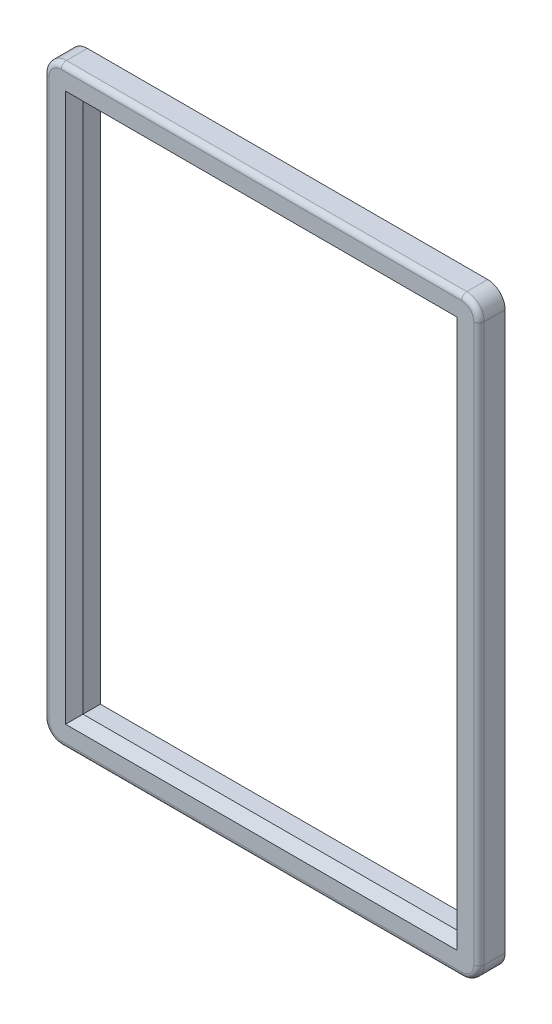
ISO-10303-21;
HEADER;
FILE_DESCRIPTION(('STEP AP214'),'2;1');
FILE_NAME('part.step','',(''),(''),'','','');
FILE_SCHEMA(('AUTOMOTIVE_DESIGN { 1 0 10303 214 1 1 1 1 }'));
ENDSEC;
DATA;
#1=APPLICATION_CONTEXT('core data for automotive mechanical design processes');
#2=APPLICATION_PROTOCOL_DEFINITION('international standard','automotive_design',2000,#1);
#3=PRODUCT_CONTEXT('',#1,'mechanical');
#4=PRODUCT('Part','Part','',(#3));
#5=PRODUCT_RELATED_PRODUCT_CATEGORY('part','',(#4));
#6=PRODUCT_DEFINITION_FORMATION('','',#4);
#7=PRODUCT_DEFINITION_CONTEXT('part definition',#1,'design');
#8=PRODUCT_DEFINITION('design','',#6,#7);
#9=PRODUCT_DEFINITION_SHAPE('','',#8);
#10=(LENGTH_UNIT() NAMED_UNIT(*) SI_UNIT(.MILLI.,.METRE.));
#11=(NAMED_UNIT(*) PLANE_ANGLE_UNIT() SI_UNIT($,.RADIAN.));
#12=(NAMED_UNIT(*) SI_UNIT($,.STERADIAN.) SOLID_ANGLE_UNIT());
#13=UNCERTAINTY_MEASURE_WITH_UNIT(LENGTH_MEASURE(1.E-05),#10,'distance_accuracy_value','');
#14=(GEOMETRIC_REPRESENTATION_CONTEXT(3) GLOBAL_UNCERTAINTY_ASSIGNED_CONTEXT((#13)) GLOBAL_UNIT_ASSIGNED_CONTEXT((#10,
#11,#12)) REPRESENTATION_CONTEXT('',''));
#15=CARTESIAN_POINT('',(0.,0.,0.));
#16=DIRECTION('',(0.,0.,1.));
#17=DIRECTION('',(1.,0.,0.));
#18=AXIS2_PLACEMENT_3D('',#15,#16,#17);
#19=CARTESIAN_POINT('',(0.,-34.,3.));
#20=DIRECTION('',(0.,1.,0.));
#21=DIRECTION('',(0.,0.,1.));
#22=AXIS2_PLACEMENT_3D('',#19,#20,#21);
#23=PLANE('',#22);
#24=DIRECTION('',(0.,0.,-1.));
#25=VECTOR('',#24,1.);
#26=CARTESIAN_POINT('',(23.,-34.,3.));
#27=LINE('',#26,#25);
#28=CARTESIAN_POINT('',(23.,-34.,0.));
#29=VERTEX_POINT('',#28);
#30=CARTESIAN_POINT('',(23.,-34.,2.4));
#31=VERTEX_POINT('',#30);
#32=EDGE_CURVE('E181',#29,#31,#27,.F.);
#33=ORIENTED_EDGE('',*,*,#32,.T.);
#34=DIRECTION('',(1.,0.,0.));
#35=VECTOR('',#34,1.);
#36=CARTESIAN_POINT('',(-23.,-34.,2.4));
#37=LINE('',#36,#35);
#38=CARTESIAN_POINT('',(-23.,-34.,2.4));
#39=VERTEX_POINT('',#38);
#40=EDGE_CURVE('E267',#31,#39,#37,.F.);
#41=ORIENTED_EDGE('',*,*,#40,.T.);
#42=DIRECTION('',(0.,0.,-1.));
#43=VECTOR('',#42,1.);
#44=CARTESIAN_POINT('',(-23.,-34.,0.));
#45=LINE('',#44,#43);
#46=CARTESIAN_POINT('',(-23.,-34.,0.));
#47=VERTEX_POINT('',#46);
#48=EDGE_CURVE('E222',#39,#47,#45,.T.);
#49=ORIENTED_EDGE('',*,*,#48,.T.);
#50=DIRECTION('',(1.,0.,0.));
#51=VECTOR('',#50,1.);
#52=CARTESIAN_POINT('',(0.,-34.,0.));
#53=LINE('',#52,#51);
#54=EDGE_CURVE('E204',#47,#29,#53,.T.);
#55=ORIENTED_EDGE('',*,*,#54,.T.);
#56=EDGE_LOOP('',(#33,#41,#49,#55));
#57=FACE_BOUND('',#56,.T.);
#58=ADVANCED_FACE('F45',(#57),#23,.F.);
#59=CARTESIAN_POINT('',(25.,0.,3.));
#60=DIRECTION('',(-1.,0.,0.));
#61=DIRECTION('',(0.,0.,1.));
#62=AXIS2_PLACEMENT_3D('',#59,#60,#61);
#63=PLANE('',#62);
#64=DIRECTION('',(0.,0.,-1.));
#65=VECTOR('',#64,1.);
#66=CARTESIAN_POINT('',(25.,32.,3.));
#67=LINE('',#66,#65);
#68=CARTESIAN_POINT('',(25.,32.,0.));
#69=VERTEX_POINT('',#68);
#70=CARTESIAN_POINT('',(25.,32.,2.4));
#71=VERTEX_POINT('',#70);
#72=EDGE_CURVE('E237',#69,#71,#67,.F.);
#73=ORIENTED_EDGE('',*,*,#72,.T.);
#74=DIRECTION('',(0.,1.,0.));
#75=VECTOR('',#74,1.);
#76=CARTESIAN_POINT('',(25.,-32.,2.4));
#77=LINE('',#76,#75);
#78=CARTESIAN_POINT('',(25.,-32.,2.4));
#79=VERTEX_POINT('',#78);
#80=EDGE_CURVE('E279',#71,#79,#77,.F.);
#81=ORIENTED_EDGE('',*,*,#80,.T.);
#82=DIRECTION('',(0.,0.,-1.));
#83=VECTOR('',#82,1.);
#84=CARTESIAN_POINT('',(25.,-32.,3.));
#85=LINE('',#84,#83);
#86=CARTESIAN_POINT('',(25.,-32.,0.));
#87=VERTEX_POINT('',#86);
#88=EDGE_CURVE('E240',#79,#87,#85,.T.);
#89=ORIENTED_EDGE('',*,*,#88,.T.);
#90=DIRECTION('',(0.,1.,0.));
#91=VECTOR('',#90,1.);
#92=CARTESIAN_POINT('',(25.,0.,0.));
#93=LINE('',#92,#91);
#94=EDGE_CURVE('E207',#87,#69,#93,.T.);
#95=ORIENTED_EDGE('',*,*,#94,.T.);
#96=EDGE_LOOP('',(#73,#81,#89,#95));
#97=FACE_BOUND('',#96,.T.);
#98=ADVANCED_FACE('F353',(#97),#63,.F.);
#99=CARTESIAN_POINT('',(0.,34.,3.));
#100=DIRECTION('',(0.,1.,0.));
#101=DIRECTION('',(0.,0.,1.));
#102=AXIS2_PLACEMENT_3D('',#99,#100,#101);
#103=PLANE('',#102);
#104=DIRECTION('',(0.,0.,-1.));
#105=VECTOR('',#104,1.);
#106=CARTESIAN_POINT('',(-23.,34.,3.));
#107=LINE('',#106,#105);
#108=CARTESIAN_POINT('',(-23.,34.,0.));
#109=VERTEX_POINT('',#108);
#110=CARTESIAN_POINT('',(-23.,34.,2.4));
#111=VERTEX_POINT('',#110);
#112=EDGE_CURVE('E242',#109,#111,#107,.F.);
#113=ORIENTED_EDGE('',*,*,#112,.T.);
#114=DIRECTION('',(1.,0.,0.));
#115=VECTOR('',#114,1.);
#116=CARTESIAN_POINT('',(0.,34.,2.4));
#117=LINE('',#116,#115);
#118=CARTESIAN_POINT('',(23.,34.,2.4));
#119=VERTEX_POINT('',#118);
#120=EDGE_CURVE('E275',#111,#119,#117,.T.);
#121=ORIENTED_EDGE('',*,*,#120,.T.);
#122=DIRECTION('',(0.,0.,-1.));
#123=VECTOR('',#122,1.);
#124=CARTESIAN_POINT('',(23.,34.,0.));
#125=LINE('',#124,#123);
#126=CARTESIAN_POINT('',(23.,34.,0.));
#127=VERTEX_POINT('',#126);
#128=EDGE_CURVE('E245',#119,#127,#125,.T.);
#129=ORIENTED_EDGE('',*,*,#128,.T.);
#130=DIRECTION('',(1.,0.,0.));
#131=VECTOR('',#130,1.);
#132=CARTESIAN_POINT('',(0.,34.,0.));
#133=LINE('',#132,#131);
#134=EDGE_CURVE('E210',#109,#127,#133,.T.);
#135=ORIENTED_EDGE('',*,*,#134,.F.);
#136=EDGE_LOOP('',(#113,#121,#129,#135));
#137=FACE_BOUND('',#136,.T.);
#138=ADVANCED_FACE('F359',(#137),#103,.T.);
#139=CARTESIAN_POINT('',(21.5,0.,3.));
#140=DIRECTION('',(-1.,0.,0.));
#141=DIRECTION('',(0.,0.,1.));
#142=AXIS2_PLACEMENT_3D('',#139,#140,#141);
#143=PLANE('',#142);
#144=DIRECTION('',(0.,0.,-1.));
#145=VECTOR('',#144,1.);
#146=CARTESIAN_POINT('',(21.5,-30.5,3.));
#147=LINE('',#146,#145);
#148=CARTESIAN_POINT('',(21.5,-30.5,2.));
#149=VERTEX_POINT('',#148);
#150=CARTESIAN_POINT('',(21.5,-30.5,0.));
#151=VERTEX_POINT('',#150);
#152=EDGE_CURVE('E172',#149,#151,#147,.T.);
#153=ORIENTED_EDGE('',*,*,#152,.F.);
#154=DIRECTION('',(0.,1.,0.));
#155=VECTOR('',#154,1.);
#156=CARTESIAN_POINT('',(21.5,0.,2.));
#157=LINE('',#156,#155);
#158=CARTESIAN_POINT('',(21.5,30.5,2.));
#159=VERTEX_POINT('',#158);
#160=EDGE_CURVE('E281',#149,#159,#157,.T.);
#161=ORIENTED_EDGE('',*,*,#160,.T.);
#162=DIRECTION('',(0.,0.,-1.));
#163=VECTOR('',#162,1.);
#164=CARTESIAN_POINT('',(21.5,30.5,3.));
#165=LINE('',#164,#163);
#166=CARTESIAN_POINT('',(21.5,30.5,0.));
#167=VERTEX_POINT('',#166);
#168=EDGE_CURVE('E187',#159,#167,#165,.T.);
#169=ORIENTED_EDGE('',*,*,#168,.T.);
#170=DIRECTION('',(0.,1.,0.));
#171=VECTOR('',#170,1.);
#172=CARTESIAN_POINT('',(21.5,0.,0.));
#173=LINE('',#172,#171);
#174=EDGE_CURVE('E185',#151,#167,#173,.T.);
#175=ORIENTED_EDGE('',*,*,#174,.F.);
#176=EDGE_LOOP('',(#153,#161,#169,#175));
#177=FACE_BOUND('',#176,.T.);
#178=ADVANCED_FACE('F186',(#177),#143,.T.);
#179=CARTESIAN_POINT('',(0.,-30.5,3.));
#180=DIRECTION('',(0.,1.,0.));
#181=DIRECTION('',(0.,0.,1.));
#182=AXIS2_PLACEMENT_3D('',#179,#180,#181);
#183=PLANE('',#182);
#184=DIRECTION('',(0.,0.,-1.));
#185=VECTOR('',#184,1.);
#186=CARTESIAN_POINT('',(-21.5,-30.5,3.));
#187=LINE('',#186,#185);
#188=CARTESIAN_POINT('',(-21.5,-30.5,2.));
#189=VERTEX_POINT('',#188);
#190=CARTESIAN_POINT('',(-21.5,-30.5,0.));
#191=VERTEX_POINT('',#190);
#192=EDGE_CURVE('E182',#189,#191,#187,.T.);
#193=ORIENTED_EDGE('',*,*,#192,.F.);
#194=DIRECTION('',(1.,0.,0.));
#195=VECTOR('',#194,1.);
#196=CARTESIAN_POINT('',(0.,-30.5,2.));
#197=LINE('',#196,#195);
#198=EDGE_CURVE('E55',#189,#149,#197,.T.);
#199=ORIENTED_EDGE('',*,*,#198,.T.);
#200=ORIENTED_EDGE('',*,*,#152,.T.);
#201=DIRECTION('',(1.,0.,0.));
#202=VECTOR('',#201,1.);
#203=CARTESIAN_POINT('',(0.,-30.5,0.));
#204=LINE('',#203,#202);
#205=EDGE_CURVE('E176',#191,#151,#204,.T.);
#206=ORIENTED_EDGE('',*,*,#205,.F.);
#207=EDGE_LOOP('',(#193,#199,#200,#206));
#208=FACE_BOUND('',#207,.T.);
#209=ADVANCED_FACE('F174',(#208),#183,.T.);
#210=CARTESIAN_POINT('',(-21.5,0.,3.));
#211=DIRECTION('',(-1.,0.,0.));
#212=DIRECTION('',(0.,0.,1.));
#213=AXIS2_PLACEMENT_3D('',#210,#211,#212);
#214=PLANE('',#213);
#215=DIRECTION('',(0.,0.,-1.));
#216=VECTOR('',#215,1.);
#217=CARTESIAN_POINT('',(-21.5,30.5,3.));
#218=LINE('',#217,#216);
#219=CARTESIAN_POINT('',(-21.5,30.5,2.));
#220=VERTEX_POINT('',#219);
#221=CARTESIAN_POINT('',(-21.5,30.5,0.));
#222=VERTEX_POINT('',#221);
#223=EDGE_CURVE('E217',#220,#222,#218,.T.);
#224=ORIENTED_EDGE('',*,*,#223,.F.);
#225=DIRECTION('',(0.,-1.,0.));
#226=VECTOR('',#225,1.);
#227=CARTESIAN_POINT('',(-21.5,-30.5,2.));
#228=LINE('',#227,#226);
#229=EDGE_CURVE('E11',#220,#189,#228,.T.);
#230=ORIENTED_EDGE('',*,*,#229,.T.);
#231=ORIENTED_EDGE('',*,*,#192,.T.);
#232=DIRECTION('',(0.,1.,0.));
#233=VECTOR('',#232,1.);
#234=CARTESIAN_POINT('',(-21.5,0.,0.));
#235=LINE('',#234,#233);
#236=EDGE_CURVE('E197',#191,#222,#235,.T.);
#237=ORIENTED_EDGE('',*,*,#236,.T.);
#238=EDGE_LOOP('',(#224,#230,#231,#237));
#239=FACE_BOUND('',#238,.T.);
#240=ADVANCED_FACE('F342',(#239),#214,.F.);
#241=CARTESIAN_POINT('',(0.,30.5,3.));
#242=DIRECTION('',(0.,1.,0.));
#243=DIRECTION('',(0.,0.,1.));
#244=AXIS2_PLACEMENT_3D('',#241,#242,#243);
#245=PLANE('',#244);
#246=ORIENTED_EDGE('',*,*,#168,.F.);
#247=DIRECTION('',(-1.,0.,0.));
#248=VECTOR('',#247,1.);
#249=CARTESIAN_POINT('',(-21.5,30.5,2.));
#250=LINE('',#249,#248);
#251=EDGE_CURVE('E69',#159,#220,#250,.T.);
#252=ORIENTED_EDGE('',*,*,#251,.T.);
#253=ORIENTED_EDGE('',*,*,#223,.T.);
#254=DIRECTION('',(1.,0.,0.));
#255=VECTOR('',#254,1.);
#256=CARTESIAN_POINT('',(0.,30.5,0.));
#257=LINE('',#256,#255);
#258=EDGE_CURVE('E199',#222,#167,#257,.T.);
#259=ORIENTED_EDGE('',*,*,#258,.T.);
#260=EDGE_LOOP('',(#246,#252,#253,#259));
#261=FACE_BOUND('',#260,.T.);
#262=ADVANCED_FACE('F341',(#261),#245,.F.);
#263=CARTESIAN_POINT('',(-25.,0.,3.));
#264=DIRECTION('',(-1.,0.,0.));
#265=DIRECTION('',(0.,0.,1.));
#266=AXIS2_PLACEMENT_3D('',#263,#264,#265);
#267=PLANE('',#266);
#268=DIRECTION('',(0.,0.,-1.));
#269=VECTOR('',#268,1.);
#270=CARTESIAN_POINT('',(-25.,-32.,3.));
#271=LINE('',#270,#269);
#272=CARTESIAN_POINT('',(-25.,-32.,0.));
#273=VERTEX_POINT('',#272);
#274=CARTESIAN_POINT('',(-25.,-32.,2.4));
#275=VERTEX_POINT('',#274);
#276=EDGE_CURVE('E234',#273,#275,#271,.F.);
#277=ORIENTED_EDGE('',*,*,#276,.T.);
#278=DIRECTION('',(0.,1.,0.));
#279=VECTOR('',#278,1.);
#280=CARTESIAN_POINT('',(-25.,0.,2.4));
#281=LINE('',#280,#279);
#282=CARTESIAN_POINT('',(-25.,32.,2.4));
#283=VERTEX_POINT('',#282);
#284=EDGE_CURVE('E271',#275,#283,#281,.T.);
#285=ORIENTED_EDGE('',*,*,#284,.T.);
#286=DIRECTION('',(0.,0.,-1.));
#287=VECTOR('',#286,1.);
#288=CARTESIAN_POINT('',(-25.,32.,3.));
#289=LINE('',#288,#287);
#290=CARTESIAN_POINT('',(-25.,32.,0.));
#291=VERTEX_POINT('',#290);
#292=EDGE_CURVE('E232',#283,#291,#289,.T.);
#293=ORIENTED_EDGE('',*,*,#292,.T.);
#294=DIRECTION('',(0.,1.,0.));
#295=VECTOR('',#294,1.);
#296=CARTESIAN_POINT('',(-25.,0.,0.));
#297=LINE('',#296,#295);
#298=EDGE_CURVE('E213',#273,#291,#297,.T.);
#299=ORIENTED_EDGE('',*,*,#298,.F.);
#300=EDGE_LOOP('',(#277,#285,#293,#299));
#301=FACE_BOUND('',#300,.T.);
#302=ADVANCED_FACE('F349',(#301),#267,.T.);
#303=CARTESIAN_POINT('',(0.,0.,3.));
#304=DIRECTION('',(0.,0.,1.));
#305=DIRECTION('',(1.,0.,0.));
#306=AXIS2_PLACEMENT_3D('',#303,#304,#305);
#307=PLANE('',#306);
#308=DIRECTION('',(1.,0.,0.));
#309=VECTOR('',#308,1.);
#310=CARTESIAN_POINT('',(21.5,31.5,3.));
#311=LINE('',#310,#309);
#312=CARTESIAN_POINT('',(-22.5,31.5,3.));
#313=VERTEX_POINT('',#312);
#314=CARTESIAN_POINT('',(22.5,31.5,3.));
#315=VERTEX_POINT('',#314);
#316=EDGE_CURVE('E310',#313,#315,#311,.T.);
#317=ORIENTED_EDGE('',*,*,#316,.T.);
#318=DIRECTION('',(0.,-1.,0.));
#319=VECTOR('',#318,1.);
#320=CARTESIAN_POINT('',(22.5,0.,3.));
#321=LINE('',#320,#319);
#322=CARTESIAN_POINT('',(22.5,-31.5,3.));
#323=VERTEX_POINT('',#322);
#324=EDGE_CURVE('E312',#315,#323,#321,.T.);
#325=ORIENTED_EDGE('',*,*,#324,.T.);
#326=DIRECTION('',(-1.,0.,0.));
#327=VECTOR('',#326,1.);
#328=CARTESIAN_POINT('',(0.,-31.5,3.));
#329=LINE('',#328,#327);
#330=CARTESIAN_POINT('',(-22.5,-31.5,3.));
#331=VERTEX_POINT('',#330);
#332=EDGE_CURVE('E308',#323,#331,#329,.T.);
#333=ORIENTED_EDGE('',*,*,#332,.T.);
#334=DIRECTION('',(0.,1.,0.));
#335=VECTOR('',#334,1.);
#336=CARTESIAN_POINT('',(-22.5,30.5,3.));
#337=LINE('',#336,#335);
#338=EDGE_CURVE('E306',#331,#313,#337,.T.);
#339=ORIENTED_EDGE('',*,*,#338,.T.);
#340=EDGE_LOOP('',(#317,#325,#333,#339));
#341=FACE_BOUND('',#340,.T.);
#342=DIRECTION('',(1.,0.,0.));
#343=VECTOR('',#342,1.);
#344=CARTESIAN_POINT('',(23.,-33.4,3.));
#345=LINE('',#344,#343);
#346=CARTESIAN_POINT('',(-23.,-33.4,3.));
#347=VERTEX_POINT('',#346);
#348=CARTESIAN_POINT('',(23.,-33.4,3.));
#349=VERTEX_POINT('',#348);
#350=EDGE_CURVE('E259',#347,#349,#345,.T.);
#351=ORIENTED_EDGE('',*,*,#350,.T.);
#352=CARTESIAN_POINT('',(23.,-32.,3.));
#353=DIRECTION('',(0.,0.,1.));
#354=DIRECTION('',(1.,0.,0.));
#355=AXIS2_PLACEMENT_3D('',#352,#353,#354);
#356=CIRCLE('',#355,1.4);
#357=CARTESIAN_POINT('',(24.4,-32.,3.));
#358=VERTEX_POINT('',#357);
#359=EDGE_CURVE('E261',#349,#358,#356,.T.);
#360=ORIENTED_EDGE('',*,*,#359,.T.);
#361=DIRECTION('',(0.,1.,0.));
#362=VECTOR('',#361,1.);
#363=CARTESIAN_POINT('',(24.4,32.,3.));
#364=LINE('',#363,#362);
#365=CARTESIAN_POINT('',(24.4,32.,3.));
#366=VERTEX_POINT('',#365);
#367=EDGE_CURVE('E247',#358,#366,#364,.T.);
#368=ORIENTED_EDGE('',*,*,#367,.T.);
#369=CARTESIAN_POINT('',(23.,32.,3.));
#370=DIRECTION('',(0.,0.,1.));
#371=DIRECTION('',(1.,0.,0.));
#372=AXIS2_PLACEMENT_3D('',#369,#370,#371);
#373=CIRCLE('',#372,1.4);
#374=CARTESIAN_POINT('',(23.,33.4,3.));
#375=VERTEX_POINT('',#374);
#376=EDGE_CURVE('E249',#366,#375,#373,.T.);
#377=ORIENTED_EDGE('',*,*,#376,.T.);
#378=DIRECTION('',(1.,0.,0.));
#379=VECTOR('',#378,1.);
#380=CARTESIAN_POINT('',(0.,33.4,3.));
#381=LINE('',#380,#379);
#382=CARTESIAN_POINT('',(-23.,33.4,3.));
#383=VERTEX_POINT('',#382);
#384=EDGE_CURVE('E251',#375,#383,#381,.F.);
#385=ORIENTED_EDGE('',*,*,#384,.T.);
#386=CARTESIAN_POINT('',(-23.,32.,3.));
#387=DIRECTION('',(0.,0.,1.));
#388=DIRECTION('',(1.,0.,0.));
#389=AXIS2_PLACEMENT_3D('',#386,#387,#388);
#390=CIRCLE('',#389,1.4);
#391=CARTESIAN_POINT('',(-24.4,32.,3.));
#392=VERTEX_POINT('',#391);
#393=EDGE_CURVE('E253',#383,#392,#390,.T.);
#394=ORIENTED_EDGE('',*,*,#393,.T.);
#395=DIRECTION('',(0.,1.,0.));
#396=VECTOR('',#395,1.);
#397=CARTESIAN_POINT('',(-24.4,0.,3.));
#398=LINE('',#397,#396);
#399=CARTESIAN_POINT('',(-24.4,-32.,3.));
#400=VERTEX_POINT('',#399);
#401=EDGE_CURVE('E255',#392,#400,#398,.F.);
#402=ORIENTED_EDGE('',*,*,#401,.T.);
#403=CARTESIAN_POINT('',(-23.,-32.,3.));
#404=DIRECTION('',(0.,0.,1.));
#405=DIRECTION('',(1.,0.,0.));
#406=AXIS2_PLACEMENT_3D('',#403,#404,#405);
#407=CIRCLE('',#406,1.4);
#408=EDGE_CURVE('E257',#400,#347,#407,.T.);
#409=ORIENTED_EDGE('',*,*,#408,.T.);
#410=EDGE_LOOP('',(#351,#360,#368,#377,#385,#394,#402,#409));
#411=FACE_BOUND('',#410,.T.);
#412=ADVANCED_FACE('F333',(#341,#411),#307,.T.);
#413=CARTESIAN_POINT('',(0.,0.,0.));
#414=DIRECTION('',(0.,0.,1.));
#415=DIRECTION('',(1.,0.,0.));
#416=AXIS2_PLACEMENT_3D('',#413,#414,#415);
#417=PLANE('',#416);
#418=CARTESIAN_POINT('',(23.,-32.,0.));
#419=DIRECTION('',(0.,0.,1.));
#420=DIRECTION('',(1.,0.,0.));
#421=AXIS2_PLACEMENT_3D('',#418,#419,#420);
#422=CIRCLE('',#421,0.499999999999999);
#423=CARTESIAN_POINT('',(23.5,-32.,0.));
#424=VERTEX_POINT('',#423);
#425=EDGE_CURVE('E429',#424,#424,#422,.T.);
#426=ORIENTED_EDGE('',*,*,#425,.T.);
#427=EDGE_LOOP('',(#426));
#428=FACE_BOUND('',#427,.T.);
#429=CARTESIAN_POINT('',(-23.,-32.,0.));
#430=DIRECTION('',(0.,0.,1.));
#431=DIRECTION('',(1.,0.,0.));
#432=AXIS2_PLACEMENT_3D('',#429,#430,#431);
#433=CIRCLE('',#432,0.499999999999999);
#434=CARTESIAN_POINT('',(-22.5,-32.,0.));
#435=VERTEX_POINT('',#434);
#436=EDGE_CURVE('E421',#435,#435,#433,.T.);
#437=ORIENTED_EDGE('',*,*,#436,.T.);
#438=EDGE_LOOP('',(#437));
#439=FACE_BOUND('',#438,.T.);
#440=CARTESIAN_POINT('',(-23.,32.,0.));
#441=DIRECTION('',(0.,0.,1.));
#442=DIRECTION('',(1.,0.,0.));
#443=AXIS2_PLACEMENT_3D('',#440,#441,#442);
#444=CIRCLE('',#443,0.499999999999999);
#445=CARTESIAN_POINT('',(-22.5,32.,0.));
#446=VERTEX_POINT('',#445);
#447=EDGE_CURVE('E416',#446,#446,#444,.T.);
#448=ORIENTED_EDGE('',*,*,#447,.T.);
#449=EDGE_LOOP('',(#448));
#450=FACE_BOUND('',#449,.T.);
#451=CARTESIAN_POINT('',(23.,32.,0.));
#452=DIRECTION('',(0.,0.,1.));
#453=DIRECTION('',(1.,0.,0.));
#454=AXIS2_PLACEMENT_3D('',#451,#452,#453);
#455=CIRCLE('',#454,0.499999999999999);
#456=CARTESIAN_POINT('',(23.5,32.,0.));
#457=VERTEX_POINT('',#456);
#458=EDGE_CURVE('E418',#457,#457,#455,.T.);
#459=ORIENTED_EDGE('',*,*,#458,.T.);
#460=EDGE_LOOP('',(#459));
#461=FACE_BOUND('',#460,.T.);
#462=ORIENTED_EDGE('',*,*,#174,.T.);
#463=ORIENTED_EDGE('',*,*,#258,.F.);
#464=ORIENTED_EDGE('',*,*,#236,.F.);
#465=ORIENTED_EDGE('',*,*,#205,.T.);
#466=EDGE_LOOP('',(#462,#463,#464,#465));
#467=FACE_BOUND('',#466,.T.);
#468=ORIENTED_EDGE('',*,*,#54,.F.);
#469=CARTESIAN_POINT('',(-23.,-32.,0.));
#470=DIRECTION('',(0.,0.,1.));
#471=DIRECTION('',(1.,0.,0.));
#472=AXIS2_PLACEMENT_3D('',#469,#470,#471);
#473=CIRCLE('',#472,2.);
#474=EDGE_CURVE('E230',#47,#273,#473,.F.);
#475=ORIENTED_EDGE('',*,*,#474,.T.);
#476=ORIENTED_EDGE('',*,*,#298,.T.);
#477=CARTESIAN_POINT('',(-23.,32.,0.));
#478=DIRECTION('',(0.,0.,1.));
#479=DIRECTION('',(1.,0.,0.));
#480=AXIS2_PLACEMENT_3D('',#477,#478,#479);
#481=CIRCLE('',#480,2.);
#482=EDGE_CURVE('E224',#291,#109,#481,.F.);
#483=ORIENTED_EDGE('',*,*,#482,.T.);
#484=ORIENTED_EDGE('',*,*,#134,.T.);
#485=CARTESIAN_POINT('',(23.,32.,0.));
#486=DIRECTION('',(0.,0.,1.));
#487=DIRECTION('',(1.,0.,0.));
#488=AXIS2_PLACEMENT_3D('',#485,#486,#487);
#489=CIRCLE('',#488,2.);
#490=EDGE_CURVE('E226',#127,#69,#489,.F.);
#491=ORIENTED_EDGE('',*,*,#490,.T.);
#492=ORIENTED_EDGE('',*,*,#94,.F.);
#493=CARTESIAN_POINT('',(23.,-32.,0.));
#494=DIRECTION('',(0.,0.,1.));
#495=DIRECTION('',(1.,0.,0.));
#496=AXIS2_PLACEMENT_3D('',#493,#494,#495);
#497=CIRCLE('',#496,2.);
#498=EDGE_CURVE('E228',#87,#29,#497,.F.);
#499=ORIENTED_EDGE('',*,*,#498,.T.);
#500=EDGE_LOOP('',(#468,#475,#476,#483,#484,#491,#492,#499));
#501=FACE_BOUND('',#500,.T.);
#502=ADVANCED_FACE('F194',(#428,#439,#450,#461,#467,#501),#417,.F.);
#503=CARTESIAN_POINT('',(-23.,-32.,3.));
#504=DIRECTION('',(0.,0.,1.));
#505=DIRECTION('',(1.,0.,0.));
#506=AXIS2_PLACEMENT_3D('',#503,#504,#505);
#507=CYLINDRICAL_SURFACE('',#506,2.);
#508=ORIENTED_EDGE('',*,*,#48,.F.);
#509=CARTESIAN_POINT('',(-23.,-32.,2.4));
#510=DIRECTION('',(0.,0.,1.));
#511=DIRECTION('',(1.,0.,0.));
#512=AXIS2_PLACEMENT_3D('',#509,#510,#511);
#513=CIRCLE('',#512,2.);
#514=EDGE_CURVE('E269',#39,#275,#513,.F.);
#515=ORIENTED_EDGE('',*,*,#514,.T.);
#516=ORIENTED_EDGE('',*,*,#276,.F.);
#517=ORIENTED_EDGE('',*,*,#474,.F.);
#518=EDGE_LOOP('',(#508,#515,#516,#517));
#519=FACE_BOUND('',#518,.T.);
#520=ADVANCED_FACE('F371',(#519),#507,.T.);
#521=CARTESIAN_POINT('',(23.,-32.,3.));
#522=DIRECTION('',(0.,0.,-1.));
#523=DIRECTION('',(-1.,0.,0.));
#524=AXIS2_PLACEMENT_3D('',#521,#522,#523);
#525=CYLINDRICAL_SURFACE('',#524,2.);
#526=ORIENTED_EDGE('',*,*,#88,.F.);
#527=CARTESIAN_POINT('',(23.,-32.,2.4));
#528=DIRECTION('',(0.,0.,1.));
#529=DIRECTION('',(1.,0.,0.));
#530=AXIS2_PLACEMENT_3D('',#527,#528,#529);
#531=CIRCLE('',#530,2.);
#532=EDGE_CURVE('E264',#79,#31,#531,.F.);
#533=ORIENTED_EDGE('',*,*,#532,.T.);
#534=ORIENTED_EDGE('',*,*,#32,.F.);
#535=ORIENTED_EDGE('',*,*,#498,.F.);
#536=EDGE_LOOP('',(#526,#533,#534,#535));
#537=FACE_BOUND('',#536,.T.);
#538=ADVANCED_FACE('F664',(#537),#525,.T.);
#539=CARTESIAN_POINT('',(23.,32.,3.));
#540=DIRECTION('',(0.,0.,1.));
#541=DIRECTION('',(1.,0.,0.));
#542=AXIS2_PLACEMENT_3D('',#539,#540,#541);
#543=CYLINDRICAL_SURFACE('',#542,2.);
#544=ORIENTED_EDGE('',*,*,#128,.F.);
#545=CARTESIAN_POINT('',(23.,32.,2.4));
#546=DIRECTION('',(0.,0.,1.));
#547=DIRECTION('',(1.,0.,0.));
#548=AXIS2_PLACEMENT_3D('',#545,#546,#547);
#549=CIRCLE('',#548,2.);
#550=EDGE_CURVE('E277',#119,#71,#549,.F.);
#551=ORIENTED_EDGE('',*,*,#550,.T.);
#552=ORIENTED_EDGE('',*,*,#72,.F.);
#553=ORIENTED_EDGE('',*,*,#490,.F.);
#554=EDGE_LOOP('',(#544,#551,#552,#553));
#555=FACE_BOUND('',#554,.T.);
#556=ADVANCED_FACE('F653',(#555),#543,.T.);
#557=CARTESIAN_POINT('',(-23.,32.,3.));
#558=DIRECTION('',(0.,0.,-1.));
#559=DIRECTION('',(-1.,0.,0.));
#560=AXIS2_PLACEMENT_3D('',#557,#558,#559);
#561=CYLINDRICAL_SURFACE('',#560,2.);
#562=ORIENTED_EDGE('',*,*,#292,.F.);
#563=CARTESIAN_POINT('',(-23.,32.,2.4));
#564=DIRECTION('',(0.,0.,1.));
#565=DIRECTION('',(1.,0.,0.));
#566=AXIS2_PLACEMENT_3D('',#563,#564,#565);
#567=CIRCLE('',#566,2.);
#568=EDGE_CURVE('E273',#283,#111,#567,.F.);
#569=ORIENTED_EDGE('',*,*,#568,.T.);
#570=ORIENTED_EDGE('',*,*,#112,.F.);
#571=ORIENTED_EDGE('',*,*,#482,.F.);
#572=EDGE_LOOP('',(#562,#569,#570,#571));
#573=FACE_BOUND('',#572,.T.);
#574=ADVANCED_FACE('F379',(#573),#561,.T.);
#575=CARTESIAN_POINT('',(23.,32.,2.));
#576=DIRECTION('',(0.,0.,-1.));
#577=DIRECTION('',(-1.,0.,0.));
#578=AXIS2_PLACEMENT_3D('',#575,#576,#577);
#579=CYLINDRICAL_SURFACE('',#578,0.499999999999999);
#580=CARTESIAN_POINT('',(23.,32.,2.));
#581=DIRECTION('',(0.,0.,1.));
#582=DIRECTION('',(1.,0.,0.));
#583=AXIS2_PLACEMENT_3D('',#580,#581,#582);
#584=CIRCLE('',#583,0.499999999999999);
#585=CARTESIAN_POINT('',(23.5,32.,2.));
#586=VERTEX_POINT('',#585);
#587=EDGE_CURVE('E191',#586,#586,#584,.T.);
#588=ORIENTED_EDGE('',*,*,#587,.T.);
#589=EDGE_LOOP('',(#588));
#590=FACE_BOUND('',#589,.T.);
#591=ORIENTED_EDGE('',*,*,#458,.F.);
#592=EDGE_LOOP('',(#591));
#593=FACE_BOUND('',#592,.T.);
#594=ADVANCED_FACE('F375',(#590,#593),#579,.F.);
#595=CARTESIAN_POINT('',(0.,0.,2.));
#596=DIRECTION('',(0.,0.,1.));
#597=DIRECTION('',(1.,0.,0.));
#598=AXIS2_PLACEMENT_3D('',#595,#596,#597);
#599=PLANE('',#598);
#600=ORIENTED_EDGE('',*,*,#587,.F.);
#601=EDGE_LOOP('',(#600));
#602=FACE_BOUND('',#601,.T.);
#603=ADVANCED_FACE('F378',(#602),#599,.F.);
#604=CARTESIAN_POINT('',(-23.,32.,2.));
#605=DIRECTION('',(0.,0.,-1.));
#606=DIRECTION('',(-1.,0.,0.));
#607=AXIS2_PLACEMENT_3D('',#604,#605,#606);
#608=CYLINDRICAL_SURFACE('',#607,0.499999999999999);
#609=CARTESIAN_POINT('',(-23.,32.,2.));
#610=DIRECTION('',(0.,0.,1.));
#611=DIRECTION('',(1.,0.,0.));
#612=AXIS2_PLACEMENT_3D('',#609,#610,#611);
#613=CIRCLE('',#612,0.499999999999999);
#614=CARTESIAN_POINT('',(-22.5,32.,2.));
#615=VERTEX_POINT('',#614);
#616=EDGE_CURVE('E413',#615,#615,#613,.T.);
#617=ORIENTED_EDGE('',*,*,#616,.T.);
#618=EDGE_LOOP('',(#617));
#619=FACE_BOUND('',#618,.T.);
#620=ORIENTED_EDGE('',*,*,#447,.F.);
#621=EDGE_LOOP('',(#620));
#622=FACE_BOUND('',#621,.T.);
#623=ADVANCED_FACE('F383',(#619,#622),#608,.F.);
#624=CARTESIAN_POINT('',(0.,0.,2.));
#625=DIRECTION('',(0.,0.,1.));
#626=DIRECTION('',(1.,0.,0.));
#627=AXIS2_PLACEMENT_3D('',#624,#625,#626);
#628=PLANE('',#627);
#629=ORIENTED_EDGE('',*,*,#616,.F.);
#630=EDGE_LOOP('',(#629));
#631=FACE_BOUND('',#630,.T.);
#632=ADVANCED_FACE('F401',(#631),#628,.F.);
#633=CARTESIAN_POINT('',(-23.,-32.,2.));
#634=DIRECTION('',(0.,0.,-1.));
#635=DIRECTION('',(-1.,0.,0.));
#636=AXIS2_PLACEMENT_3D('',#633,#634,#635);
#637=CYLINDRICAL_SURFACE('',#636,0.499999999999999);
#638=CARTESIAN_POINT('',(-23.,-32.,2.));
#639=DIRECTION('',(0.,0.,1.));
#640=DIRECTION('',(1.,0.,0.));
#641=AXIS2_PLACEMENT_3D('',#638,#639,#640);
#642=CIRCLE('',#641,0.499999999999999);
#643=CARTESIAN_POINT('',(-22.5,-32.,2.));
#644=VERTEX_POINT('',#643);
#645=EDGE_CURVE('E426',#644,#644,#642,.T.);
#646=ORIENTED_EDGE('',*,*,#645,.T.);
#647=EDGE_LOOP('',(#646));
#648=FACE_BOUND('',#647,.T.);
#649=ORIENTED_EDGE('',*,*,#436,.F.);
#650=EDGE_LOOP('',(#649));
#651=FACE_BOUND('',#650,.T.);
#652=ADVANCED_FACE('F397',(#648,#651),#637,.F.);
#653=CARTESIAN_POINT('',(-23.,-32.,2.));
#654=DIRECTION('',(0.,0.,1.));
#655=DIRECTION('',(1.,0.,0.));
#656=AXIS2_PLACEMENT_3D('',#653,#654,#655);
#657=PLANE('',#656);
#658=ORIENTED_EDGE('',*,*,#645,.F.);
#659=EDGE_LOOP('',(#658));
#660=FACE_BOUND('',#659,.T.);
#661=ADVANCED_FACE('F393',(#660),#657,.F.);
#662=CARTESIAN_POINT('',(23.,-32.,2.));
#663=DIRECTION('',(0.,0.,-1.));
#664=DIRECTION('',(-1.,0.,0.));
#665=AXIS2_PLACEMENT_3D('',#662,#663,#664);
#666=CYLINDRICAL_SURFACE('',#665,0.499999999999999);
#667=CARTESIAN_POINT('',(23.,-32.,2.));
#668=DIRECTION('',(0.,0.,1.));
#669=DIRECTION('',(1.,0.,0.));
#670=AXIS2_PLACEMENT_3D('',#667,#668,#669);
#671=CIRCLE('',#670,0.499999999999999);
#672=CARTESIAN_POINT('',(23.5,-32.,2.));
#673=VERTEX_POINT('',#672);
#674=EDGE_CURVE('E304',#673,#673,#671,.T.);
#675=ORIENTED_EDGE('',*,*,#674,.T.);
#676=EDGE_LOOP('',(#675));
#677=FACE_BOUND('',#676,.T.);
#678=ORIENTED_EDGE('',*,*,#425,.F.);
#679=EDGE_LOOP('',(#678));
#680=FACE_BOUND('',#679,.T.);
#681=ADVANCED_FACE('F389',(#677,#680),#666,.F.);
#682=CARTESIAN_POINT('',(23.,-32.,2.));
#683=DIRECTION('',(0.,0.,1.));
#684=DIRECTION('',(1.,0.,0.));
#685=AXIS2_PLACEMENT_3D('',#682,#683,#684);
#686=PLANE('',#685);
#687=ORIENTED_EDGE('',*,*,#674,.F.);
#688=EDGE_LOOP('',(#687));
#689=FACE_BOUND('',#688,.T.);
#690=ADVANCED_FACE('F385',(#689),#686,.F.);
#691=CARTESIAN_POINT('',(-23.,32.,2.4));
#692=DIRECTION('',(0.,0.,1.));
#693=DIRECTION('',(1.,0.,0.));
#694=AXIS2_PLACEMENT_3D('',#691,#692,#693);
#695=TOROIDAL_SURFACE('',#694,1.4,0.6);
#696=CARTESIAN_POINT('',(-23.,33.4,2.4));
#697=DIRECTION('',(1.,0.,0.));
#698=DIRECTION('',(0.,0.,-1.));
#699=AXIS2_PLACEMENT_3D('',#696,#697,#698);
#700=CIRCLE('',#699,0.6);
#701=EDGE_CURVE('E298',#111,#383,#700,.T.);
#702=ORIENTED_EDGE('',*,*,#701,.F.);
#703=ORIENTED_EDGE('',*,*,#568,.F.);
#704=CARTESIAN_POINT('',(-24.4,32.,2.4));
#705=DIRECTION('',(0.,-1.,0.));
#706=DIRECTION('',(0.,0.,-1.));
#707=AXIS2_PLACEMENT_3D('',#704,#705,#706);
#708=CIRCLE('',#707,0.6);
#709=EDGE_CURVE('E301',#392,#283,#708,.T.);
#710=ORIENTED_EDGE('',*,*,#709,.F.);
#711=ORIENTED_EDGE('',*,*,#393,.F.);
#712=EDGE_LOOP('',(#702,#703,#710,#711));
#713=FACE_BOUND('',#712,.T.);
#714=ADVANCED_FACE('F388',(#713),#695,.T.);
#715=CARTESIAN_POINT('',(-24.4,0.,2.4));
#716=DIRECTION('',(0.,1.,0.));
#717=DIRECTION('',(0.,0.,1.));
#718=AXIS2_PLACEMENT_3D('',#715,#716,#717);
#719=CYLINDRICAL_SURFACE('',#718,0.6);
#720=ORIENTED_EDGE('',*,*,#709,.T.);
#721=ORIENTED_EDGE('',*,*,#284,.F.);
#722=CARTESIAN_POINT('',(-24.4,-32.,2.4));
#723=DIRECTION('',(0.,-1.,0.));
#724=DIRECTION('',(0.,0.,-1.));
#725=AXIS2_PLACEMENT_3D('',#722,#723,#724);
#726=CIRCLE('',#725,0.6);
#727=EDGE_CURVE('E295',#400,#275,#726,.T.);
#728=ORIENTED_EDGE('',*,*,#727,.F.);
#729=ORIENTED_EDGE('',*,*,#401,.F.);
#730=EDGE_LOOP('',(#720,#721,#728,#729));
#731=FACE_BOUND('',#730,.T.);
#732=ADVANCED_FACE('F474',(#731),#719,.T.);
#733=CARTESIAN_POINT('',(0.,33.4,2.4));
#734=DIRECTION('',(1.,0.,0.));
#735=DIRECTION('',(0.,0.,-1.));
#736=AXIS2_PLACEMENT_3D('',#733,#734,#735);
#737=CYLINDRICAL_SURFACE('',#736,0.6);
#738=ORIENTED_EDGE('',*,*,#701,.T.);
#739=ORIENTED_EDGE('',*,*,#384,.F.);
#740=CARTESIAN_POINT('',(23.,33.4,2.4));
#741=DIRECTION('',(1.,0.,0.));
#742=DIRECTION('',(0.,0.,-1.));
#743=AXIS2_PLACEMENT_3D('',#740,#741,#742);
#744=CIRCLE('',#743,0.6);
#745=EDGE_CURVE('E292',#119,#375,#744,.T.);
#746=ORIENTED_EDGE('',*,*,#745,.F.);
#747=ORIENTED_EDGE('',*,*,#120,.F.);
#748=EDGE_LOOP('',(#738,#739,#746,#747));
#749=FACE_BOUND('',#748,.T.);
#750=ADVANCED_FACE('F483',(#749),#737,.T.);
#751=CARTESIAN_POINT('',(-23.,-32.,2.4));
#752=DIRECTION('',(0.,0.,1.));
#753=DIRECTION('',(1.,0.,0.));
#754=AXIS2_PLACEMENT_3D('',#751,#752,#753);
#755=TOROIDAL_SURFACE('',#754,1.4,0.6);
#756=ORIENTED_EDGE('',*,*,#727,.T.);
#757=ORIENTED_EDGE('',*,*,#514,.F.);
#758=CARTESIAN_POINT('',(-23.,-33.4,2.4));
#759=DIRECTION('',(1.,0.,0.));
#760=DIRECTION('',(0.,0.,-1.));
#761=AXIS2_PLACEMENT_3D('',#758,#759,#760);
#762=CIRCLE('',#761,0.6);
#763=EDGE_CURVE('E289',#347,#39,#762,.T.);
#764=ORIENTED_EDGE('',*,*,#763,.F.);
#765=ORIENTED_EDGE('',*,*,#408,.F.);
#766=EDGE_LOOP('',(#756,#757,#764,#765));
#767=FACE_BOUND('',#766,.T.);
#768=ADVANCED_FACE('F491',(#767),#755,.T.);
#769=CARTESIAN_POINT('',(23.,32.,2.4));
#770=DIRECTION('',(0.,0.,1.));
#771=DIRECTION('',(1.,0.,0.));
#772=AXIS2_PLACEMENT_3D('',#769,#770,#771);
#773=TOROIDAL_SURFACE('',#772,1.4,0.6);
#774=ORIENTED_EDGE('',*,*,#745,.T.);
#775=ORIENTED_EDGE('',*,*,#376,.F.);
#776=CARTESIAN_POINT('',(24.4,32.,2.4));
#777=DIRECTION('',(0.,-1.,0.));
#778=DIRECTION('',(0.,0.,-1.));
#779=AXIS2_PLACEMENT_3D('',#776,#777,#778);
#780=CIRCLE('',#779,0.6);
#781=EDGE_CURVE('E286',#71,#366,#780,.T.);
#782=ORIENTED_EDGE('',*,*,#781,.F.);
#783=ORIENTED_EDGE('',*,*,#550,.F.);
#784=EDGE_LOOP('',(#774,#775,#782,#783));
#785=FACE_BOUND('',#784,.T.);
#786=ADVANCED_FACE('F499',(#785),#773,.T.);
#787=CARTESIAN_POINT('',(0.,-33.4,2.4));
#788=DIRECTION('',(-1.,0.,0.));
#789=DIRECTION('',(0.,0.,1.));
#790=AXIS2_PLACEMENT_3D('',#787,#788,#789);
#791=CYLINDRICAL_SURFACE('',#790,0.6);
#792=ORIENTED_EDGE('',*,*,#763,.T.);
#793=ORIENTED_EDGE('',*,*,#40,.F.);
#794=CARTESIAN_POINT('',(23.,-33.4,2.4));
#795=DIRECTION('',(1.,0.,0.));
#796=DIRECTION('',(0.,0.,-1.));
#797=AXIS2_PLACEMENT_3D('',#794,#795,#796);
#798=CIRCLE('',#797,0.6);
#799=EDGE_CURVE('E284',#349,#31,#798,.T.);
#800=ORIENTED_EDGE('',*,*,#799,.F.);
#801=ORIENTED_EDGE('',*,*,#350,.F.);
#802=EDGE_LOOP('',(#792,#793,#800,#801));
#803=FACE_BOUND('',#802,.T.);
#804=ADVANCED_FACE('F507',(#803),#791,.T.);
#805=CARTESIAN_POINT('',(24.4,0.,2.4));
#806=DIRECTION('',(0.,-1.,0.));
#807=DIRECTION('',(0.,0.,-1.));
#808=AXIS2_PLACEMENT_3D('',#805,#806,#807);
#809=CYLINDRICAL_SURFACE('',#808,0.6);
#810=ORIENTED_EDGE('',*,*,#781,.T.);
#811=ORIENTED_EDGE('',*,*,#367,.F.);
#812=CARTESIAN_POINT('',(24.4,-32.,2.4));
#813=DIRECTION('',(0.,-1.,0.));
#814=DIRECTION('',(0.,0.,-1.));
#815=AXIS2_PLACEMENT_3D('',#812,#813,#814);
#816=CIRCLE('',#815,0.6);
#817=EDGE_CURVE('E282',#79,#358,#816,.T.);
#818=ORIENTED_EDGE('',*,*,#817,.F.);
#819=ORIENTED_EDGE('',*,*,#80,.F.);
#820=EDGE_LOOP('',(#810,#811,#818,#819));
#821=FACE_BOUND('',#820,.T.);
#822=ADVANCED_FACE('F515',(#821),#809,.T.);
#823=CARTESIAN_POINT('',(23.,-32.,2.4));
#824=DIRECTION('',(0.,0.,1.));
#825=DIRECTION('',(1.,0.,0.));
#826=AXIS2_PLACEMENT_3D('',#823,#824,#825);
#827=TOROIDAL_SURFACE('',#826,1.4,0.6);
#828=ORIENTED_EDGE('',*,*,#799,.T.);
#829=ORIENTED_EDGE('',*,*,#532,.F.);
#830=ORIENTED_EDGE('',*,*,#817,.T.);
#831=ORIENTED_EDGE('',*,*,#359,.F.);
#832=EDGE_LOOP('',(#828,#829,#830,#831));
#833=FACE_BOUND('',#832,.T.);
#834=ADVANCED_FACE('F523',(#833),#827,.T.);
#835=CARTESIAN_POINT('',(-22.5,0.,3.));
#836=DIRECTION('',(0.70710678118655,0.,0.707106781186545));
#837=DIRECTION('',(0.,-1.,0.));
#838=AXIS2_PLACEMENT_3D('',#835,#836,#837);
#839=PLANE('',#838);
#840=DIRECTION('',(-0.577350269189624,0.577350269189624,0.577350269189628));
#841=VECTOR('',#840,1.);
#842=CARTESIAN_POINT('',(-15.,24.,-4.50000000000002));
#843=LINE('',#842,#841);
#844=EDGE_CURVE('E320',#313,#220,#843,.F.);
#845=ORIENTED_EDGE('',*,*,#844,.F.);
#846=ORIENTED_EDGE('',*,*,#338,.F.);
#847=DIRECTION('',(-0.577350269189624,-0.577350269189624,0.577350269189628));
#848=VECTOR('',#847,1.);
#849=CARTESIAN_POINT('',(-14.3333333333334,-23.3333333333334,-5.16666666666669));
#850=LINE('',#849,#848);
#851=EDGE_CURVE('E50',#189,#331,#850,.T.);
#852=ORIENTED_EDGE('',*,*,#851,.F.);
#853=ORIENTED_EDGE('',*,*,#229,.F.);
#854=EDGE_LOOP('',(#845,#846,#852,#853));
#855=FACE_BOUND('',#854,.T.);
#856=ADVANCED_FACE('F48',(#855),#839,.T.);
#857=CARTESIAN_POINT('',(0.,-30.5,2.));
#858=DIRECTION('',(0.,-0.70710678118655,-0.707106781186545));
#859=DIRECTION('',(1.,0.,0.));
#860=AXIS2_PLACEMENT_3D('',#857,#858,#859);
#861=PLANE('',#860);
#862=ORIENTED_EDGE('',*,*,#851,.T.);
#863=ORIENTED_EDGE('',*,*,#332,.F.);
#864=DIRECTION('',(-0.577350269189624,0.577350269189624,-0.577350269189628));
#865=VECTOR('',#864,1.);
#866=CARTESIAN_POINT('',(11.3333333333334,-20.3333333333334,-8.16666666666669));
#867=LINE('',#866,#865);
#868=EDGE_CURVE('E319',#149,#323,#867,.F.);
#869=ORIENTED_EDGE('',*,*,#868,.F.);
#870=ORIENTED_EDGE('',*,*,#198,.F.);
#871=EDGE_LOOP('',(#862,#863,#869,#870));
#872=FACE_BOUND('',#871,.T.);
#873=ADVANCED_FACE('F329',(#872),#861,.F.);
#874=CARTESIAN_POINT('',(0.,31.5,3.));
#875=DIRECTION('',(0.,-0.70710678118655,0.707106781186545));
#876=DIRECTION('',(-1.,0.,0.));
#877=AXIS2_PLACEMENT_3D('',#874,#875,#876);
#878=PLANE('',#877);
#879=ORIENTED_EDGE('',*,*,#844,.T.);
#880=ORIENTED_EDGE('',*,*,#251,.F.);
#881=DIRECTION('',(-0.577350269189624,-0.577350269189624,-0.577350269189628));
#882=VECTOR('',#881,1.);
#883=CARTESIAN_POINT('',(11.3333333333334,20.3333333333334,-8.16666666666669));
#884=LINE('',#883,#882);
#885=EDGE_CURVE('E317',#315,#159,#884,.T.);
#886=ORIENTED_EDGE('',*,*,#885,.F.);
#887=ORIENTED_EDGE('',*,*,#316,.F.);
#888=EDGE_LOOP('',(#879,#880,#886,#887));
#889=FACE_BOUND('',#888,.T.);
#890=ADVANCED_FACE('F340',(#889),#878,.T.);
#891=CARTESIAN_POINT('',(21.5,0.,2.));
#892=DIRECTION('',(0.70710678118655,0.,-0.707106781186545));
#893=DIRECTION('',(0.,1.,0.));
#894=AXIS2_PLACEMENT_3D('',#891,#892,#893);
#895=PLANE('',#894);
#896=ORIENTED_EDGE('',*,*,#868,.T.);
#897=ORIENTED_EDGE('',*,*,#324,.F.);
#898=ORIENTED_EDGE('',*,*,#885,.T.);
#899=ORIENTED_EDGE('',*,*,#160,.F.);
#900=EDGE_LOOP('',(#896,#897,#898,#899));
#901=FACE_BOUND('',#900,.T.);
#902=ADVANCED_FACE('F338',(#901),#895,.F.);
#903=CLOSED_SHELL('',(#58,#98,#138,#178,#209,#240,#262,#302,#412,#502,#520,#538,#556,#574,#594,
#603,#623,#632,#652,#661,#681,#690,#714,#732,#750,#768,#786,#804,#822,#834,#856,#873,#890,#902));
#904=MANIFOLD_SOLID_BREP('B2',#903);
#905=ADVANCED_BREP_SHAPE_REPRESENTATION('',(#18,#904),#14);
#906=SHAPE_DEFINITION_REPRESENTATION(#9,#905);
ENDSEC;
END-ISO-10303-21;
